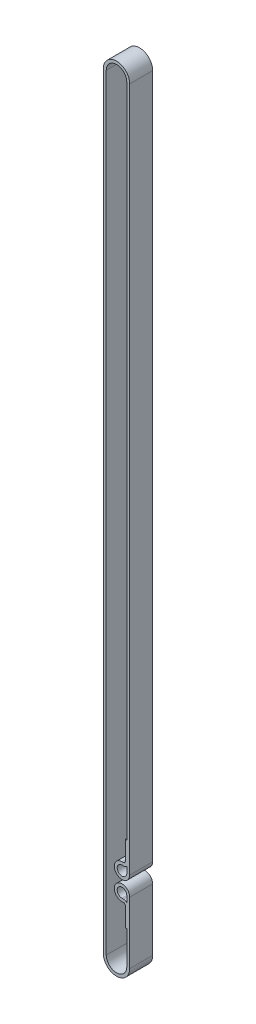
ISO-10303-21;
HEADER;
FILE_DESCRIPTION(('STEP AP214'),'2;1');
FILE_NAME('part.step','',(''),(''),'','','');
FILE_SCHEMA(('AUTOMOTIVE_DESIGN { 1 0 10303 214 1 1 1 1 }'));
ENDSEC;
DATA;
#1=APPLICATION_CONTEXT('core data for automotive mechanical design processes');
#2=APPLICATION_PROTOCOL_DEFINITION('international standard','automotive_design',2000,#1);
#3=PRODUCT_CONTEXT('',#1,'mechanical');
#4=PRODUCT('Part','Part','',(#3));
#5=PRODUCT_RELATED_PRODUCT_CATEGORY('part','',(#4));
#6=PRODUCT_DEFINITION_FORMATION('','',#4);
#7=PRODUCT_DEFINITION_CONTEXT('part definition',#1,'design');
#8=PRODUCT_DEFINITION('design','',#6,#7);
#9=PRODUCT_DEFINITION_SHAPE('','',#8);
#10=(LENGTH_UNIT() NAMED_UNIT(*) SI_UNIT(.MILLI.,.METRE.));
#11=(NAMED_UNIT(*) PLANE_ANGLE_UNIT() SI_UNIT($,.RADIAN.));
#12=(NAMED_UNIT(*) SI_UNIT($,.STERADIAN.) SOLID_ANGLE_UNIT());
#13=UNCERTAINTY_MEASURE_WITH_UNIT(LENGTH_MEASURE(1.E-05),#10,'distance_accuracy_value','');
#14=(GEOMETRIC_REPRESENTATION_CONTEXT(3) GLOBAL_UNCERTAINTY_ASSIGNED_CONTEXT((#13)) GLOBAL_UNIT_ASSIGNED_CONTEXT((#10,
#11,#12)) REPRESENTATION_CONTEXT('',''));
#15=CARTESIAN_POINT('',(0.,0.,0.));
#16=DIRECTION('',(0.,0.,1.));
#17=DIRECTION('',(1.,0.,0.));
#18=AXIS2_PLACEMENT_3D('',#15,#16,#17);
#19=CARTESIAN_POINT('',(4.591,-342.696,12.));
#20=DIRECTION('',(0.,1.,0.));
#21=DIRECTION('',(0.,0.,1.));
#22=AXIS2_PLACEMENT_3D('',#19,#20,#21);
#23=PLANE('',#22);
#24=DIRECTION('',(1.,0.,0.));
#25=VECTOR('',#24,1.);
#26=CARTESIAN_POINT('',(4.591,-342.696,0.));
#27=LINE('',#26,#25);
#28=CARTESIAN_POINT('',(4.591,-342.696,0.));
#29=VERTEX_POINT('',#28);
#30=CARTESIAN_POINT('',(5.36099999999995,-342.696,0.));
#31=VERTEX_POINT('',#30);
#32=EDGE_CURVE('E180',#29,#31,#27,.T.);
#33=ORIENTED_EDGE('',*,*,#32,.F.);
#34=DIRECTION('',(0.,0.,-1.));
#35=VECTOR('',#34,1.);
#36=CARTESIAN_POINT('',(4.591,-342.696,12.));
#37=LINE('',#36,#35);
#38=CARTESIAN_POINT('',(4.591,-342.696,12.));
#39=VERTEX_POINT('',#38);
#40=EDGE_CURVE('E11',#39,#29,#37,.T.);
#41=ORIENTED_EDGE('',*,*,#40,.F.);
#42=DIRECTION('',(1.,0.,0.));
#43=VECTOR('',#42,1.);
#44=CARTESIAN_POINT('',(4.591,-342.696,12.));
#45=LINE('',#44,#43);
#46=CARTESIAN_POINT('',(5.36099999999995,-342.696,12.));
#47=VERTEX_POINT('',#46);
#48=EDGE_CURVE('E223',#39,#47,#45,.T.);
#49=ORIENTED_EDGE('',*,*,#48,.T.);
#50=DIRECTION('',(0.,0.,1.));
#51=VECTOR('',#50,1.);
#52=CARTESIAN_POINT('',(5.36099999999995,-342.696,-412.926271627272));
#53=LINE('',#52,#51);
#54=EDGE_CURVE('E309',#31,#47,#53,.T.);
#55=ORIENTED_EDGE('',*,*,#54,.F.);
#56=EDGE_LOOP('',(#33,#41,#49,#55));
#57=FACE_BOUND('',#56,.T.);
#58=ADVANCED_FACE('F41',(#57),#23,.T.);
#59=CARTESIAN_POINT('',(4.591,-342.696,12.));
#60=DIRECTION('',(-1.,0.,0.));
#61=DIRECTION('',(0.,0.,1.));
#62=AXIS2_PLACEMENT_3D('',#59,#60,#61);
#63=PLANE('',#62);
#64=DIRECTION('',(0.,1.,0.));
#65=VECTOR('',#64,1.);
#66=CARTESIAN_POINT('',(4.591,-342.696,0.));
#67=LINE('',#66,#65);
#68=CARTESIAN_POINT('',(4.591,-352.696,0.));
#69=VERTEX_POINT('',#68);
#70=EDGE_CURVE('E183',#69,#29,#67,.T.);
#71=ORIENTED_EDGE('',*,*,#70,.F.);
#72=DIRECTION('',(0.,0.,-1.));
#73=VECTOR('',#72,1.);
#74=CARTESIAN_POINT('',(4.591,-352.696,12.));
#75=LINE('',#74,#73);
#76=CARTESIAN_POINT('',(4.591,-352.696,12.));
#77=VERTEX_POINT('',#76);
#78=EDGE_CURVE('E49',#77,#69,#75,.T.);
#79=ORIENTED_EDGE('',*,*,#78,.F.);
#80=DIRECTION('',(0.,1.,0.));
#81=VECTOR('',#80,1.);
#82=CARTESIAN_POINT('',(4.591,-342.696,12.));
#83=LINE('',#82,#81);
#84=EDGE_CURVE('E265',#77,#39,#83,.T.);
#85=ORIENTED_EDGE('',*,*,#84,.T.);
#86=ORIENTED_EDGE('',*,*,#40,.T.);
#87=EDGE_LOOP('',(#71,#79,#85,#86));
#88=FACE_BOUND('',#87,.T.);
#89=ADVANCED_FACE('F252',(#88),#63,.T.);
#90=CARTESIAN_POINT('',(3.607,-352.696,12.));
#91=DIRECTION('',(0.,0.,-1.));
#92=DIRECTION('',(-1.,0.,0.));
#93=AXIS2_PLACEMENT_3D('',#90,#91,#92);
#94=CYLINDRICAL_SURFACE('',#93,0.984000000000029);
#95=CARTESIAN_POINT('',(3.607,-352.696,0.));
#96=DIRECTION('',(0.,0.,1.));
#97=DIRECTION('',(1.,0.,0.));
#98=AXIS2_PLACEMENT_3D('',#95,#96,#97);
#99=CIRCLE('',#98,0.984000000000029);
#100=CARTESIAN_POINT('',(3.607,-353.68,0.));
#101=VERTEX_POINT('',#100);
#102=EDGE_CURVE('E187',#101,#69,#99,.T.);
#103=ORIENTED_EDGE('',*,*,#102,.F.);
#104=DIRECTION('',(0.,0.,-1.));
#105=VECTOR('',#104,1.);
#106=CARTESIAN_POINT('',(3.607,-353.68,12.));
#107=LINE('',#106,#105);
#108=CARTESIAN_POINT('',(3.607,-353.68,12.));
#109=VERTEX_POINT('',#108);
#110=EDGE_CURVE('E241',#109,#101,#107,.T.);
#111=ORIENTED_EDGE('',*,*,#110,.F.);
#112=CARTESIAN_POINT('',(3.607,-352.696,12.));
#113=DIRECTION('',(0.,0.,1.));
#114=DIRECTION('',(1.,0.,0.));
#115=AXIS2_PLACEMENT_3D('',#112,#113,#114);
#116=CIRCLE('',#115,0.984000000000029);
#117=EDGE_CURVE('E248',#109,#77,#116,.T.);
#118=ORIENTED_EDGE('',*,*,#117,.T.);
#119=ORIENTED_EDGE('',*,*,#78,.T.);
#120=EDGE_LOOP('',(#103,#111,#118,#119));
#121=FACE_BOUND('',#120,.T.);
#122=ADVANCED_FACE('F246',(#121),#94,.F.);
#123=CARTESIAN_POINT('',(2.861,-353.68,12.));
#124=DIRECTION('',(0.,1.,0.));
#125=DIRECTION('',(0.,0.,1.));
#126=AXIS2_PLACEMENT_3D('',#123,#124,#125);
#127=PLANE('',#126);
#128=DIRECTION('',(1.,0.,0.));
#129=VECTOR('',#128,1.);
#130=CARTESIAN_POINT('',(2.861,-353.68,0.));
#131=LINE('',#130,#129);
#132=CARTESIAN_POINT('',(2.861,-353.68,0.));
#133=VERTEX_POINT('',#132);
#134=EDGE_CURVE('E190',#133,#101,#131,.T.);
#135=ORIENTED_EDGE('',*,*,#134,.F.);
#136=DIRECTION('',(0.,0.,-1.));
#137=VECTOR('',#136,1.);
#138=CARTESIAN_POINT('',(2.861,-353.68,12.));
#139=LINE('',#138,#137);
#140=CARTESIAN_POINT('',(2.861,-353.68,12.));
#141=VERTEX_POINT('',#140);
#142=EDGE_CURVE('E239',#141,#133,#139,.T.);
#143=ORIENTED_EDGE('',*,*,#142,.F.);
#144=DIRECTION('',(1.,0.,0.));
#145=VECTOR('',#144,1.);
#146=CARTESIAN_POINT('',(2.861,-353.68,12.));
#147=LINE('',#146,#145);
#148=EDGE_CURVE('E262',#141,#109,#147,.T.);
#149=ORIENTED_EDGE('',*,*,#148,.T.);
#150=ORIENTED_EDGE('',*,*,#110,.T.);
#151=EDGE_LOOP('',(#135,#143,#149,#150));
#152=FACE_BOUND('',#151,.T.);
#153=ADVANCED_FACE('F259',(#152),#127,.T.);
#154=CARTESIAN_POINT('',(2.861,-357.7,12.));
#155=DIRECTION('',(0.,0.,-1.));
#156=DIRECTION('',(-1.,0.,0.));
#157=AXIS2_PLACEMENT_3D('',#154,#155,#156);
#158=CYLINDRICAL_SURFACE('',#157,4.01999999999995);
#159=CARTESIAN_POINT('',(2.861,-357.7,0.));
#160=DIRECTION('',(0.,0.,1.));
#161=DIRECTION('',(1.,0.,0.));
#162=AXIS2_PLACEMENT_3D('',#159,#160,#161);
#163=CIRCLE('',#162,4.01999999999995);
#164=CARTESIAN_POINT('',(6.88099999999995,-357.7,0.));
#165=VERTEX_POINT('',#164);
#166=EDGE_CURVE('E193',#165,#133,#163,.F.);
#167=ORIENTED_EDGE('',*,*,#166,.F.);
#168=DIRECTION('',(0.,0.,-1.));
#169=VECTOR('',#168,1.);
#170=CARTESIAN_POINT('',(6.88099999999995,-357.7,12.));
#171=LINE('',#170,#169);
#172=CARTESIAN_POINT('',(6.88099999999995,-357.7,12.));
#173=VERTEX_POINT('',#172);
#174=EDGE_CURVE('E237',#173,#165,#171,.T.);
#175=ORIENTED_EDGE('',*,*,#174,.F.);
#176=CARTESIAN_POINT('',(2.861,-357.7,12.));
#177=DIRECTION('',(0.,0.,1.));
#178=DIRECTION('',(1.,0.,0.));
#179=AXIS2_PLACEMENT_3D('',#176,#177,#178);
#180=CIRCLE('',#179,4.01999999999995);
#181=EDGE_CURVE('E267',#173,#141,#180,.F.);
#182=ORIENTED_EDGE('',*,*,#181,.T.);
#183=ORIENTED_EDGE('',*,*,#142,.T.);
#184=EDGE_LOOP('',(#167,#175,#182,#183));
#185=FACE_BOUND('',#184,.T.);
#186=ADVANCED_FACE('F755',(#185),#158,.T.);
#187=CARTESIAN_POINT('',(6.88099999999995,-357.7,12.));
#188=DIRECTION('',(1.,0.,0.));
#189=DIRECTION('',(0.,1.,0.));
#190=AXIS2_PLACEMENT_3D('',#187,#188,#189);
#191=PLANE('',#190);
#192=DIRECTION('',(0.,-1.,0.));
#193=VECTOR('',#192,1.);
#194=CARTESIAN_POINT('',(6.88099999999995,-357.7,0.));
#195=LINE('',#194,#193);
#196=CARTESIAN_POINT('',(6.881,0.,0.));
#197=VERTEX_POINT('',#196);
#198=EDGE_CURVE('E196',#197,#165,#195,.T.);
#199=ORIENTED_EDGE('',*,*,#198,.F.);
#200=DIRECTION('',(0.,0.,-1.));
#201=VECTOR('',#200,1.);
#202=CARTESIAN_POINT('',(6.881,0.,12.));
#203=LINE('',#202,#201);
#204=CARTESIAN_POINT('',(6.881,0.,12.));
#205=VERTEX_POINT('',#204);
#206=EDGE_CURVE('E235',#205,#197,#203,.T.);
#207=ORIENTED_EDGE('',*,*,#206,.F.);
#208=DIRECTION('',(0.,-1.,0.));
#209=VECTOR('',#208,1.);
#210=CARTESIAN_POINT('',(6.88099999999995,-357.7,12.));
#211=LINE('',#210,#209);
#212=EDGE_CURVE('E273',#205,#173,#211,.T.);
#213=ORIENTED_EDGE('',*,*,#212,.T.);
#214=ORIENTED_EDGE('',*,*,#174,.T.);
#215=EDGE_LOOP('',(#199,#207,#213,#214));
#216=FACE_BOUND('',#215,.T.);
#217=ADVANCED_FACE('F631',(#216),#191,.T.);
#218=CARTESIAN_POINT('',(0.,0.,12.));
#219=DIRECTION('',(0.,0.,-1.));
#220=DIRECTION('',(-1.,0.,0.));
#221=AXIS2_PLACEMENT_3D('',#218,#219,#220);
#222=CYLINDRICAL_SURFACE('',#221,6.881);
#223=CARTESIAN_POINT('',(0.,0.,0.));
#224=DIRECTION('',(0.,0.,1.));
#225=DIRECTION('',(1.,0.,0.));
#226=AXIS2_PLACEMENT_3D('',#223,#224,#225);
#227=CIRCLE('',#226,6.881);
#228=CARTESIAN_POINT('',(-6.881,0.,0.));
#229=VERTEX_POINT('',#228);
#230=EDGE_CURVE('E199',#229,#197,#227,.F.);
#231=ORIENTED_EDGE('',*,*,#230,.F.);
#232=DIRECTION('',(0.,0.,-1.));
#233=VECTOR('',#232,1.);
#234=CARTESIAN_POINT('',(-6.881,0.,12.));
#235=LINE('',#234,#233);
#236=CARTESIAN_POINT('',(-6.881,0.,12.));
#237=VERTEX_POINT('',#236);
#238=EDGE_CURVE('E233',#237,#229,#235,.T.);
#239=ORIENTED_EDGE('',*,*,#238,.F.);
#240=CARTESIAN_POINT('',(0.,0.,12.));
#241=DIRECTION('',(0.,0.,1.));
#242=DIRECTION('',(1.,0.,0.));
#243=AXIS2_PLACEMENT_3D('',#240,#241,#242);
#244=CIRCLE('',#243,6.881);
#245=EDGE_CURVE('E276',#237,#205,#244,.F.);
#246=ORIENTED_EDGE('',*,*,#245,.T.);
#247=ORIENTED_EDGE('',*,*,#206,.T.);
#248=EDGE_LOOP('',(#231,#239,#246,#247));
#249=FACE_BOUND('',#248,.T.);
#250=ADVANCED_FACE('F625',(#249),#222,.T.);
#251=CARTESIAN_POINT('',(-6.881,0.,12.));
#252=DIRECTION('',(-1.,0.,0.));
#253=DIRECTION('',(0.,-1.,0.));
#254=AXIS2_PLACEMENT_3D('',#251,#252,#253);
#255=PLANE('',#254);
#256=DIRECTION('',(0.,1.,0.));
#257=VECTOR('',#256,1.);
#258=CARTESIAN_POINT('',(-6.881,0.,0.));
#259=LINE('',#258,#257);
#260=CARTESIAN_POINT('',(-6.88099999999995,-400.,0.));
#261=VERTEX_POINT('',#260);
#262=EDGE_CURVE('E202',#261,#229,#259,.T.);
#263=ORIENTED_EDGE('',*,*,#262,.F.);
#264=DIRECTION('',(0.,0.,-1.));
#265=VECTOR('',#264,1.);
#266=CARTESIAN_POINT('',(-6.88099999999995,-400.,12.));
#267=LINE('',#266,#265);
#268=CARTESIAN_POINT('',(-6.88099999999995,-400.,12.));
#269=VERTEX_POINT('',#268);
#270=EDGE_CURVE('E231',#269,#261,#267,.T.);
#271=ORIENTED_EDGE('',*,*,#270,.F.);
#272=DIRECTION('',(0.,1.,0.));
#273=VECTOR('',#272,1.);
#274=CARTESIAN_POINT('',(-6.881,0.,12.));
#275=LINE('',#274,#273);
#276=EDGE_CURVE('E279',#269,#237,#275,.T.);
#277=ORIENTED_EDGE('',*,*,#276,.T.);
#278=ORIENTED_EDGE('',*,*,#238,.T.);
#279=EDGE_LOOP('',(#263,#271,#277,#278));
#280=FACE_BOUND('',#279,.T.);
#281=ADVANCED_FACE('F630',(#280),#255,.T.);
#282=CARTESIAN_POINT('',(0.,-400.,12.));
#283=DIRECTION('',(0.,0.,-1.));
#284=DIRECTION('',(-1.,0.,0.));
#285=AXIS2_PLACEMENT_3D('',#282,#283,#284);
#286=CYLINDRICAL_SURFACE('',#285,6.88099999999995);
#287=CARTESIAN_POINT('',(0.,-400.,0.));
#288=DIRECTION('',(0.,0.,1.));
#289=DIRECTION('',(1.,0.,0.));
#290=AXIS2_PLACEMENT_3D('',#287,#288,#289);
#291=CIRCLE('',#290,6.88099999999995);
#292=CARTESIAN_POINT('',(6.88099999999995,-400.,0.));
#293=VERTEX_POINT('',#292);
#294=EDGE_CURVE('E205',#293,#261,#291,.F.);
#295=ORIENTED_EDGE('',*,*,#294,.F.);
#296=DIRECTION('',(0.,0.,-1.));
#297=VECTOR('',#296,1.);
#298=CARTESIAN_POINT('',(6.88099999999995,-400.,12.));
#299=LINE('',#298,#297);
#300=CARTESIAN_POINT('',(6.88099999999995,-400.,12.));
#301=VERTEX_POINT('',#300);
#302=EDGE_CURVE('E229',#301,#293,#299,.T.);
#303=ORIENTED_EDGE('',*,*,#302,.F.);
#304=CARTESIAN_POINT('',(0.,-400.,12.));
#305=DIRECTION('',(0.,0.,1.));
#306=DIRECTION('',(1.,0.,0.));
#307=AXIS2_PLACEMENT_3D('',#304,#305,#306);
#308=CIRCLE('',#307,6.88099999999995);
#309=EDGE_CURVE('E282',#301,#269,#308,.F.);
#310=ORIENTED_EDGE('',*,*,#309,.T.);
#311=ORIENTED_EDGE('',*,*,#270,.T.);
#312=EDGE_LOOP('',(#295,#303,#310,#311));
#313=FACE_BOUND('',#312,.T.);
#314=ADVANCED_FACE('F615',(#313),#286,.T.);
#315=CARTESIAN_POINT('',(6.88099999999995,-400.,12.));
#316=DIRECTION('',(1.,0.,0.));
#317=DIRECTION('',(0.,0.,-1.));
#318=AXIS2_PLACEMENT_3D('',#315,#316,#317);
#319=PLANE('',#318);
#320=DIRECTION('',(0.,1.,0.));
#321=VECTOR('',#320,1.);
#322=CARTESIAN_POINT('',(6.88099999999995,-400.,0.));
#323=LINE('',#322,#321);
#324=CARTESIAN_POINT('',(6.88099999999995,-367.7,0.));
#325=VERTEX_POINT('',#324);
#326=EDGE_CURVE('E208',#325,#293,#323,.F.);
#327=ORIENTED_EDGE('',*,*,#326,.F.);
#328=DIRECTION('',(0.,0.,-1.));
#329=VECTOR('',#328,1.);
#330=CARTESIAN_POINT('',(6.88099999999995,-367.7,12.));
#331=LINE('',#330,#329);
#332=CARTESIAN_POINT('',(6.88099999999995,-367.7,12.));
#333=VERTEX_POINT('',#332);
#334=EDGE_CURVE('E227',#333,#325,#331,.T.);
#335=ORIENTED_EDGE('',*,*,#334,.F.);
#336=DIRECTION('',(0.,1.,0.));
#337=VECTOR('',#336,1.);
#338=CARTESIAN_POINT('',(6.88099999999995,-400.,12.));
#339=LINE('',#338,#337);
#340=EDGE_CURVE('E285',#333,#301,#339,.F.);
#341=ORIENTED_EDGE('',*,*,#340,.T.);
#342=ORIENTED_EDGE('',*,*,#302,.T.);
#343=EDGE_LOOP('',(#327,#335,#341,#342));
#344=FACE_BOUND('',#343,.T.);
#345=ADVANCED_FACE('F610',(#344),#319,.T.);
#346=CARTESIAN_POINT('',(2.861,-367.7,12.));
#347=DIRECTION('',(0.,0.,-1.));
#348=DIRECTION('',(-1.,0.,0.));
#349=AXIS2_PLACEMENT_3D('',#346,#347,#348);
#350=CYLINDRICAL_SURFACE('',#349,4.01999999999995);
#351=CARTESIAN_POINT('',(2.861,-367.7,0.));
#352=DIRECTION('',(0.,0.,1.));
#353=DIRECTION('',(1.,0.,0.));
#354=AXIS2_PLACEMENT_3D('',#351,#352,#353);
#355=CIRCLE('',#354,4.01999999999995);
#356=CARTESIAN_POINT('',(2.861,-371.72,0.));
#357=VERTEX_POINT('',#356);
#358=EDGE_CURVE('E211',#357,#325,#355,.F.);
#359=ORIENTED_EDGE('',*,*,#358,.F.);
#360=DIRECTION('',(0.,0.,-1.));
#361=VECTOR('',#360,1.);
#362=CARTESIAN_POINT('',(2.861,-371.72,12.));
#363=LINE('',#362,#361);
#364=CARTESIAN_POINT('',(2.861,-371.72,12.));
#365=VERTEX_POINT('',#364);
#366=EDGE_CURVE('E159',#365,#357,#363,.T.);
#367=ORIENTED_EDGE('',*,*,#366,.F.);
#368=CARTESIAN_POINT('',(2.861,-367.7,12.));
#369=DIRECTION('',(0.,0.,1.));
#370=DIRECTION('',(1.,0.,0.));
#371=AXIS2_PLACEMENT_3D('',#368,#369,#370);
#372=CIRCLE('',#371,4.01999999999995);
#373=EDGE_CURVE('E170',#365,#333,#372,.F.);
#374=ORIENTED_EDGE('',*,*,#373,.T.);
#375=ORIENTED_EDGE('',*,*,#334,.T.);
#376=EDGE_LOOP('',(#359,#367,#374,#375));
#377=FACE_BOUND('',#376,.T.);
#378=ADVANCED_FACE('F289',(#377),#350,.T.);
#379=CARTESIAN_POINT('',(2.861,-371.72,12.));
#380=DIRECTION('',(0.,-1.,0.));
#381=DIRECTION('',(0.,0.,-1.));
#382=AXIS2_PLACEMENT_3D('',#379,#380,#381);
#383=PLANE('',#382);
#384=DIRECTION('',(1.,0.,0.));
#385=VECTOR('',#384,1.);
#386=CARTESIAN_POINT('',(2.861,-371.72,0.));
#387=LINE('',#386,#385);
#388=CARTESIAN_POINT('',(3.607,-371.72,0.));
#389=VERTEX_POINT('',#388);
#390=EDGE_CURVE('E155',#389,#357,#387,.F.);
#391=ORIENTED_EDGE('',*,*,#390,.F.);
#392=DIRECTION('',(0.,0.,-1.));
#393=VECTOR('',#392,1.);
#394=CARTESIAN_POINT('',(3.607,-371.72,12.));
#395=LINE('',#394,#393);
#396=CARTESIAN_POINT('',(3.607,-371.72,12.));
#397=VERTEX_POINT('',#396);
#398=EDGE_CURVE('E150',#397,#389,#395,.T.);
#399=ORIENTED_EDGE('',*,*,#398,.F.);
#400=DIRECTION('',(1.,0.,0.));
#401=VECTOR('',#400,1.);
#402=CARTESIAN_POINT('',(2.861,-371.72,12.));
#403=LINE('',#402,#401);
#404=EDGE_CURVE('E153',#397,#365,#403,.F.);
#405=ORIENTED_EDGE('',*,*,#404,.T.);
#406=ORIENTED_EDGE('',*,*,#366,.T.);
#407=EDGE_LOOP('',(#391,#399,#405,#406));
#408=FACE_BOUND('',#407,.T.);
#409=ADVANCED_FACE('F152',(#408),#383,.T.);
#410=CARTESIAN_POINT('',(3.607,-372.704,12.));
#411=DIRECTION('',(0.,0.,-1.));
#412=DIRECTION('',(-1.,0.,0.));
#413=AXIS2_PLACEMENT_3D('',#410,#411,#412);
#414=CYLINDRICAL_SURFACE('',#413,0.984000000000029);
#415=CARTESIAN_POINT('',(3.607,-372.704,0.));
#416=DIRECTION('',(0.,0.,1.));
#417=DIRECTION('',(1.,0.,0.));
#418=AXIS2_PLACEMENT_3D('',#415,#416,#417);
#419=CIRCLE('',#418,0.984000000000029);
#420=CARTESIAN_POINT('',(4.59100000000003,-372.704,0.));
#421=VERTEX_POINT('',#420);
#422=EDGE_CURVE('E215',#421,#389,#419,.T.);
#423=ORIENTED_EDGE('',*,*,#422,.F.);
#424=DIRECTION('',(0.,0.,-1.));
#425=VECTOR('',#424,1.);
#426=CARTESIAN_POINT('',(4.59100000000003,-372.704,12.));
#427=LINE('',#426,#425);
#428=CARTESIAN_POINT('',(4.59100000000003,-372.704,12.));
#429=VERTEX_POINT('',#428);
#430=EDGE_CURVE('E101',#429,#421,#427,.T.);
#431=ORIENTED_EDGE('',*,*,#430,.F.);
#432=CARTESIAN_POINT('',(3.607,-372.704,12.));
#433=DIRECTION('',(0.,0.,1.));
#434=DIRECTION('',(1.,0.,0.));
#435=AXIS2_PLACEMENT_3D('',#432,#433,#434);
#436=CIRCLE('',#435,0.984000000000029);
#437=EDGE_CURVE('E167',#429,#397,#436,.T.);
#438=ORIENTED_EDGE('',*,*,#437,.T.);
#439=ORIENTED_EDGE('',*,*,#398,.T.);
#440=EDGE_LOOP('',(#423,#431,#438,#439));
#441=FACE_BOUND('',#440,.T.);
#442=ADVANCED_FACE('F172',(#441),#414,.F.);
#443=CARTESIAN_POINT('',(4.591,-382.704,12.));
#444=DIRECTION('',(-1.,0.,0.));
#445=DIRECTION('',(0.,0.,1.));
#446=AXIS2_PLACEMENT_3D('',#443,#444,#445);
#447=PLANE('',#446);
#448=DIRECTION('',(0.,1.,0.));
#449=VECTOR('',#448,1.);
#450=CARTESIAN_POINT('',(4.591,-382.704,0.));
#451=LINE('',#450,#449);
#452=CARTESIAN_POINT('',(4.591,-382.704,0.));
#453=VERTEX_POINT('',#452);
#454=EDGE_CURVE('E217',#453,#421,#451,.T.);
#455=ORIENTED_EDGE('',*,*,#454,.F.);
#456=DIRECTION('',(0.,0.,-1.));
#457=VECTOR('',#456,1.);
#458=CARTESIAN_POINT('',(4.591,-382.704,12.));
#459=LINE('',#458,#457);
#460=CARTESIAN_POINT('',(4.591,-382.704,12.));
#461=VERTEX_POINT('',#460);
#462=EDGE_CURVE('E57',#461,#453,#459,.T.);
#463=ORIENTED_EDGE('',*,*,#462,.F.);
#464=DIRECTION('',(0.,1.,0.));
#465=VECTOR('',#464,1.);
#466=CARTESIAN_POINT('',(4.591,-382.704,12.));
#467=LINE('',#466,#465);
#468=EDGE_CURVE('E173',#461,#429,#467,.T.);
#469=ORIENTED_EDGE('',*,*,#468,.T.);
#470=ORIENTED_EDGE('',*,*,#430,.T.);
#471=EDGE_LOOP('',(#455,#463,#469,#470));
#472=FACE_BOUND('',#471,.T.);
#473=ADVANCED_FACE('F292',(#472),#447,.T.);
#474=CARTESIAN_POINT('',(5.107,-382.704,12.));
#475=DIRECTION('',(0.,-1.,0.));
#476=DIRECTION('',(0.,0.,-1.));
#477=AXIS2_PLACEMENT_3D('',#474,#475,#476);
#478=PLANE('',#477);
#479=DIRECTION('',(-1.,0.,0.));
#480=VECTOR('',#479,1.);
#481=CARTESIAN_POINT('',(5.107,-382.704,0.));
#482=LINE('',#481,#480);
#483=CARTESIAN_POINT('',(5.36099999999995,-382.704,0.));
#484=VERTEX_POINT('',#483);
#485=EDGE_CURVE('E220',#484,#453,#482,.T.);
#486=ORIENTED_EDGE('',*,*,#485,.F.);
#487=DIRECTION('',(0.,0.,1.));
#488=VECTOR('',#487,1.);
#489=CARTESIAN_POINT('',(5.36099999999995,-382.704,-412.926271627272));
#490=LINE('',#489,#488);
#491=CARTESIAN_POINT('',(5.36099999999995,-382.704,12.));
#492=VERTEX_POINT('',#491);
#493=EDGE_CURVE('E403',#484,#492,#490,.T.);
#494=ORIENTED_EDGE('',*,*,#493,.T.);
#495=DIRECTION('',(-1.,0.,0.));
#496=VECTOR('',#495,1.);
#497=CARTESIAN_POINT('',(5.107,-382.704,12.));
#498=LINE('',#497,#496);
#499=EDGE_CURVE('E175',#492,#461,#498,.T.);
#500=ORIENTED_EDGE('',*,*,#499,.T.);
#501=ORIENTED_EDGE('',*,*,#462,.T.);
#502=EDGE_LOOP('',(#486,#494,#500,#501));
#503=FACE_BOUND('',#502,.T.);
#504=ADVANCED_FACE('F294',(#503),#478,.T.);
#505=CARTESIAN_POINT('',(3.607,-352.696,12.));
#506=DIRECTION('',(0.,0.,1.));
#507=DIRECTION('',(1.,0.,0.));
#508=AXIS2_PLACEMENT_3D('',#505,#506,#507);
#509=PLANE('',#508);
#510=ORIENTED_EDGE('',*,*,#499,.F.);
#511=DIRECTION('',(0.,-1.,0.));
#512=VECTOR('',#511,1.);
#513=CARTESIAN_POINT('',(5.36099999999993,0.,12.));
#514=LINE('',#513,#512);
#515=CARTESIAN_POINT('',(5.36099999999995,-400.,12.));
#516=VERTEX_POINT('',#515);
#517=EDGE_CURVE('E356',#492,#516,#514,.T.);
#518=ORIENTED_EDGE('',*,*,#517,.T.);
#519=CARTESIAN_POINT('',(0.,-400.,12.));
#520=DIRECTION('',(0.,0.,1.));
#521=DIRECTION('',(1.,0.,0.));
#522=AXIS2_PLACEMENT_3D('',#519,#520,#521);
#523=CIRCLE('',#522,5.36099999999995);
#524=CARTESIAN_POINT('',(-5.36099999999995,-400.,12.));
#525=VERTEX_POINT('',#524);
#526=EDGE_CURVE('E368',#525,#516,#523,.T.);
#527=ORIENTED_EDGE('',*,*,#526,.F.);
#528=DIRECTION('',(0.,1.,0.));
#529=VECTOR('',#528,1.);
#530=CARTESIAN_POINT('',(-5.361,0.,12.));
#531=LINE('',#530,#529);
#532=CARTESIAN_POINT('',(-5.361,0.,12.));
#533=VERTEX_POINT('',#532);
#534=EDGE_CURVE('E357',#525,#533,#531,.T.);
#535=ORIENTED_EDGE('',*,*,#534,.T.);
#536=CARTESIAN_POINT('',(0.,0.,12.));
#537=DIRECTION('',(0.,0.,1.));
#538=DIRECTION('',(1.,0.,0.));
#539=AXIS2_PLACEMENT_3D('',#536,#537,#538);
#540=CIRCLE('',#539,5.361);
#541=CARTESIAN_POINT('',(5.361,0.,12.));
#542=VERTEX_POINT('',#541);
#543=EDGE_CURVE('E355',#542,#533,#540,.T.);
#544=ORIENTED_EDGE('',*,*,#543,.F.);
#545=DIRECTION('',(0.,-1.,0.));
#546=VECTOR('',#545,1.);
#547=CARTESIAN_POINT('',(5.361,0.,12.));
#548=LINE('',#547,#546);
#549=EDGE_CURVE('E352',#542,#47,#548,.T.);
#550=ORIENTED_EDGE('',*,*,#549,.T.);
#551=ORIENTED_EDGE('',*,*,#48,.F.);
#552=ORIENTED_EDGE('',*,*,#84,.F.);
#553=ORIENTED_EDGE('',*,*,#117,.F.);
#554=ORIENTED_EDGE('',*,*,#148,.F.);
#555=ORIENTED_EDGE('',*,*,#181,.F.);
#556=ORIENTED_EDGE('',*,*,#212,.F.);
#557=ORIENTED_EDGE('',*,*,#245,.F.);
#558=ORIENTED_EDGE('',*,*,#276,.F.);
#559=ORIENTED_EDGE('',*,*,#309,.F.);
#560=ORIENTED_EDGE('',*,*,#340,.F.);
#561=ORIENTED_EDGE('',*,*,#373,.F.);
#562=ORIENTED_EDGE('',*,*,#404,.F.);
#563=ORIENTED_EDGE('',*,*,#437,.F.);
#564=ORIENTED_EDGE('',*,*,#468,.F.);
#565=EDGE_LOOP('',(#510,#518,#527,#535,#544,#550,#551,#552,#553,#554,#555,#556,#557,#558,#559,
#560,#561,#562,#563,#564));
#566=FACE_BOUND('',#565,.T.);
#567=CARTESIAN_POINT('',(2.861,-367.7,12.));
#568=DIRECTION('',(0.,0.,1.));
#569=DIRECTION('',(1.,0.,0.));
#570=AXIS2_PLACEMENT_3D('',#567,#568,#569);
#571=CIRCLE('',#570,2.49999999999995);
#572=CARTESIAN_POINT('',(5.36099999999995,-367.7,12.));
#573=VERTEX_POINT('',#572);
#574=CARTESIAN_POINT('',(2.861,-370.2,12.));
#575=VERTEX_POINT('',#574);
#576=EDGE_CURVE('E392',#573,#575,#571,.T.);
#577=ORIENTED_EDGE('',*,*,#576,.F.);
#578=DIRECTION('',(0.,-1.,0.));
#579=VECTOR('',#578,1.);
#580=CARTESIAN_POINT('',(5.36099999999995,0.,12.));
#581=LINE('',#580,#579);
#582=CARTESIAN_POINT('',(5.36099999999995,-370.916963346766,12.));
#583=VERTEX_POINT('',#582);
#584=EDGE_CURVE('E360',#573,#583,#581,.T.);
#585=ORIENTED_EDGE('',*,*,#584,.T.);
#586=CARTESIAN_POINT('',(3.607,-372.704,12.));
#587=DIRECTION('',(0.,0.,1.));
#588=DIRECTION('',(1.,0.,0.));
#589=AXIS2_PLACEMENT_3D('',#586,#587,#588);
#590=CIRCLE('',#589,2.504);
#591=CARTESIAN_POINT('',(3.60700000000007,-370.2,12.));
#592=VERTEX_POINT('',#591);
#593=EDGE_CURVE('E498',#583,#592,#590,.T.);
#594=ORIENTED_EDGE('',*,*,#593,.T.);
#595=DIRECTION('',(-1.,0.,0.));
#596=VECTOR('',#595,1.);
#597=CARTESIAN_POINT('',(-2.75472227691817E-11,-370.2,12.));
#598=LINE('',#597,#596);
#599=EDGE_CURVE('E494',#592,#575,#598,.T.);
#600=ORIENTED_EDGE('',*,*,#599,.T.);
#601=EDGE_LOOP('',(#577,#585,#594,#600));
#602=FACE_BOUND('',#601,.T.);
#603=CARTESIAN_POINT('',(2.861,-357.7,12.));
#604=DIRECTION('',(0.,0.,1.));
#605=DIRECTION('',(1.,0.,0.));
#606=AXIS2_PLACEMENT_3D('',#603,#604,#605);
#607=CIRCLE('',#606,2.49999999999995);
#608=CARTESIAN_POINT('',(2.861,-355.2,12.));
#609=VERTEX_POINT('',#608);
#610=CARTESIAN_POINT('',(5.36099999999995,-357.7,12.));
#611=VERTEX_POINT('',#610);
#612=EDGE_CURVE('E379',#609,#611,#607,.T.);
#613=ORIENTED_EDGE('',*,*,#612,.F.);
#614=DIRECTION('',(1.,0.,0.));
#615=VECTOR('',#614,1.);
#616=CARTESIAN_POINT('',(0.,-355.2,12.));
#617=LINE('',#616,#615);
#618=CARTESIAN_POINT('',(3.607,-355.2,12.));
#619=VERTEX_POINT('',#618);
#620=EDGE_CURVE('E497',#609,#619,#617,.T.);
#621=ORIENTED_EDGE('',*,*,#620,.T.);
#622=CARTESIAN_POINT('',(3.607,-352.696,12.));
#623=DIRECTION('',(0.,0.,1.));
#624=DIRECTION('',(1.,0.,0.));
#625=AXIS2_PLACEMENT_3D('',#622,#623,#624);
#626=CIRCLE('',#625,2.50400000000005);
#627=CARTESIAN_POINT('',(5.36099999999995,-354.483036653234,12.));
#628=VERTEX_POINT('',#627);
#629=EDGE_CURVE('E501',#619,#628,#626,.T.);
#630=ORIENTED_EDGE('',*,*,#629,.T.);
#631=DIRECTION('',(0.,-1.,0.));
#632=VECTOR('',#631,1.);
#633=CARTESIAN_POINT('',(5.36100000000014,0.,12.));
#634=LINE('',#633,#632);
#635=EDGE_CURVE('E346',#628,#611,#634,.T.);
#636=ORIENTED_EDGE('',*,*,#635,.T.);
#637=EDGE_LOOP('',(#613,#621,#630,#636));
#638=FACE_BOUND('',#637,.T.);
#639=ADVANCED_FACE('F165',(#566,#602,#638),#509,.T.);
#640=CARTESIAN_POINT('',(3.607,-352.696,0.));
#641=DIRECTION('',(0.,0.,1.));
#642=DIRECTION('',(1.,0.,0.));
#643=AXIS2_PLACEMENT_3D('',#640,#641,#642);
#644=PLANE('',#643);
#645=ORIENTED_EDGE('',*,*,#32,.T.);
#646=DIRECTION('',(0.,1.,0.));
#647=VECTOR('',#646,1.);
#648=CARTESIAN_POINT('',(5.361,0.,0.));
#649=LINE('',#648,#647);
#650=CARTESIAN_POINT('',(5.361,0.,0.));
#651=VERTEX_POINT('',#650);
#652=EDGE_CURVE('E314',#31,#651,#649,.T.);
#653=ORIENTED_EDGE('',*,*,#652,.T.);
#654=CARTESIAN_POINT('',(0.,0.,0.));
#655=DIRECTION('',(0.,0.,1.));
#656=DIRECTION('',(1.,0.,0.));
#657=AXIS2_PLACEMENT_3D('',#654,#655,#656);
#658=CIRCLE('',#657,5.361);
#659=CARTESIAN_POINT('',(-5.361,0.,0.));
#660=VERTEX_POINT('',#659);
#661=EDGE_CURVE('E336',#660,#651,#658,.F.);
#662=ORIENTED_EDGE('',*,*,#661,.F.);
#663=DIRECTION('',(0.,-1.,0.));
#664=VECTOR('',#663,1.);
#665=CARTESIAN_POINT('',(-5.361,0.,0.));
#666=LINE('',#665,#664);
#667=CARTESIAN_POINT('',(-5.36099999999995,-400.,0.));
#668=VERTEX_POINT('',#667);
#669=EDGE_CURVE('E326',#660,#668,#666,.T.);
#670=ORIENTED_EDGE('',*,*,#669,.T.);
#671=CARTESIAN_POINT('',(0.,-400.,0.));
#672=DIRECTION('',(0.,0.,1.));
#673=DIRECTION('',(1.,0.,0.));
#674=AXIS2_PLACEMENT_3D('',#671,#672,#673);
#675=CIRCLE('',#674,5.36099999999995);
#676=CARTESIAN_POINT('',(5.36099999999995,-400.,0.));
#677=VERTEX_POINT('',#676);
#678=EDGE_CURVE('E395',#677,#668,#675,.F.);
#679=ORIENTED_EDGE('',*,*,#678,.F.);
#680=DIRECTION('',(0.,1.,0.));
#681=VECTOR('',#680,1.);
#682=CARTESIAN_POINT('',(5.36099999999993,0.,0.));
#683=LINE('',#682,#681);
#684=EDGE_CURVE('E327',#677,#484,#683,.T.);
#685=ORIENTED_EDGE('',*,*,#684,.T.);
#686=ORIENTED_EDGE('',*,*,#485,.T.);
#687=ORIENTED_EDGE('',*,*,#454,.T.);
#688=ORIENTED_EDGE('',*,*,#422,.T.);
#689=ORIENTED_EDGE('',*,*,#390,.T.);
#690=ORIENTED_EDGE('',*,*,#358,.T.);
#691=ORIENTED_EDGE('',*,*,#326,.T.);
#692=ORIENTED_EDGE('',*,*,#294,.T.);
#693=ORIENTED_EDGE('',*,*,#262,.T.);
#694=ORIENTED_EDGE('',*,*,#230,.T.);
#695=ORIENTED_EDGE('',*,*,#198,.T.);
#696=ORIENTED_EDGE('',*,*,#166,.T.);
#697=ORIENTED_EDGE('',*,*,#134,.T.);
#698=ORIENTED_EDGE('',*,*,#102,.T.);
#699=ORIENTED_EDGE('',*,*,#70,.T.);
#700=EDGE_LOOP('',(#645,#653,#662,#670,#679,#685,#686,#687,#688,#689,#690,#691,#692,#693,#694,
#695,#696,#697,#698,#699));
#701=FACE_BOUND('',#700,.T.);
#702=DIRECTION('',(0.,1.,0.));
#703=VECTOR('',#702,1.);
#704=CARTESIAN_POINT('',(5.36100000000014,0.,0.));
#705=LINE('',#704,#703);
#706=CARTESIAN_POINT('',(5.36099999999995,-357.7,0.));
#707=VERTEX_POINT('',#706);
#708=CARTESIAN_POINT('',(5.36099999999996,-354.483036653234,0.));
#709=VERTEX_POINT('',#708);
#710=EDGE_CURVE('E342',#707,#709,#705,.T.);
#711=ORIENTED_EDGE('',*,*,#710,.T.);
#712=CARTESIAN_POINT('',(3.607,-352.696,0.));
#713=DIRECTION('',(0.,0.,1.));
#714=DIRECTION('',(1.,0.,0.));
#715=AXIS2_PLACEMENT_3D('',#712,#713,#714);
#716=CIRCLE('',#715,2.50400000000005);
#717=CARTESIAN_POINT('',(3.607,-355.2,0.));
#718=VERTEX_POINT('',#717);
#719=EDGE_CURVE('E345',#709,#718,#716,.F.);
#720=ORIENTED_EDGE('',*,*,#719,.T.);
#721=DIRECTION('',(-1.,0.,0.));
#722=VECTOR('',#721,1.);
#723=CARTESIAN_POINT('',(0.,-355.2,0.));
#724=LINE('',#723,#722);
#725=CARTESIAN_POINT('',(2.861,-355.2,0.));
#726=VERTEX_POINT('',#725);
#727=EDGE_CURVE('E332',#718,#726,#724,.T.);
#728=ORIENTED_EDGE('',*,*,#727,.T.);
#729=CARTESIAN_POINT('',(2.861,-357.7,0.));
#730=DIRECTION('',(0.,0.,1.));
#731=DIRECTION('',(1.,0.,0.));
#732=AXIS2_PLACEMENT_3D('',#729,#730,#731);
#733=CIRCLE('',#732,2.49999999999995);
#734=EDGE_CURVE('E338',#707,#726,#733,.F.);
#735=ORIENTED_EDGE('',*,*,#734,.F.);
#736=EDGE_LOOP('',(#711,#720,#728,#735));
#737=FACE_BOUND('',#736,.T.);
#738=DIRECTION('',(1.,0.,0.));
#739=VECTOR('',#738,1.);
#740=CARTESIAN_POINT('',(-2.75472227691817E-11,-370.2,0.));
#741=LINE('',#740,#739);
#742=CARTESIAN_POINT('',(2.861,-370.2,0.));
#743=VERTEX_POINT('',#742);
#744=CARTESIAN_POINT('',(3.60700000000007,-370.2,0.));
#745=VERTEX_POINT('',#744);
#746=EDGE_CURVE('E330',#743,#745,#741,.T.);
#747=ORIENTED_EDGE('',*,*,#746,.T.);
#748=CARTESIAN_POINT('',(3.607,-372.704,0.));
#749=DIRECTION('',(0.,0.,1.));
#750=DIRECTION('',(1.,0.,0.));
#751=AXIS2_PLACEMENT_3D('',#748,#749,#750);
#752=CIRCLE('',#751,2.504);
#753=CARTESIAN_POINT('',(5.36099999999995,-370.916963346766,0.));
#754=VERTEX_POINT('',#753);
#755=EDGE_CURVE('E416',#745,#754,#752,.F.);
#756=ORIENTED_EDGE('',*,*,#755,.T.);
#757=DIRECTION('',(0.,1.,0.));
#758=VECTOR('',#757,1.);
#759=CARTESIAN_POINT('',(5.36099999999995,0.,0.));
#760=LINE('',#759,#758);
#761=CARTESIAN_POINT('',(5.36099999999995,-367.7,0.));
#762=VERTEX_POINT('',#761);
#763=EDGE_CURVE('E184',#754,#762,#760,.T.);
#764=ORIENTED_EDGE('',*,*,#763,.T.);
#765=CARTESIAN_POINT('',(2.861,-367.7,0.));
#766=DIRECTION('',(0.,0.,1.));
#767=DIRECTION('',(1.,0.,0.));
#768=AXIS2_PLACEMENT_3D('',#765,#766,#767);
#769=CIRCLE('',#768,2.49999999999995);
#770=EDGE_CURVE('E382',#743,#762,#769,.F.);
#771=ORIENTED_EDGE('',*,*,#770,.F.);
#772=EDGE_LOOP('',(#747,#756,#764,#771));
#773=FACE_BOUND('',#772,.T.);
#774=ADVANCED_FACE('F254',(#701,#737,#773),#644,.F.);
#775=CARTESIAN_POINT('',(2.861,-357.7,-412.926271627272));
#776=DIRECTION('',(0.,0.,1.));
#777=DIRECTION('',(1.,0.,0.));
#778=AXIS2_PLACEMENT_3D('',#775,#776,#777);
#779=CYLINDRICAL_SURFACE('',#778,2.49999999999995);
#780=DIRECTION('',(0.,0.,1.));
#781=VECTOR('',#780,1.);
#782=CARTESIAN_POINT('',(5.36099999999995,-357.7,-412.926271627272));
#783=LINE('',#782,#781);
#784=EDGE_CURVE('E375',#707,#611,#783,.T.);
#785=ORIENTED_EDGE('',*,*,#784,.F.);
#786=ORIENTED_EDGE('',*,*,#734,.T.);
#787=DIRECTION('',(0.,0.,1.));
#788=VECTOR('',#787,1.);
#789=CARTESIAN_POINT('',(2.861,-355.2,-412.926271627272));
#790=LINE('',#789,#788);
#791=EDGE_CURVE('E341',#726,#609,#790,.T.);
#792=ORIENTED_EDGE('',*,*,#791,.T.);
#793=ORIENTED_EDGE('',*,*,#612,.T.);
#794=EDGE_LOOP('',(#785,#786,#792,#793));
#795=FACE_BOUND('',#794,.T.);
#796=ADVANCED_FACE('F550',(#795),#779,.F.);
#797=CARTESIAN_POINT('',(5.36100000000014,0.,-412.926271627272));
#798=DIRECTION('',(-1.,0.,0.));
#799=DIRECTION('',(0.,-1.,0.));
#800=AXIS2_PLACEMENT_3D('',#797,#798,#799);
#801=PLANE('',#800);
#802=ORIENTED_EDGE('',*,*,#710,.F.);
#803=ORIENTED_EDGE('',*,*,#784,.T.);
#804=ORIENTED_EDGE('',*,*,#635,.F.);
#805=DIRECTION('',(0.,0.,1.));
#806=VECTOR('',#805,1.);
#807=CARTESIAN_POINT('',(5.36099999999995,-354.483036653234,-412.926271627272));
#808=LINE('',#807,#806);
#809=EDGE_CURVE('E378',#709,#628,#808,.T.);
#810=ORIENTED_EDGE('',*,*,#809,.F.);
#811=EDGE_LOOP('',(#802,#803,#804,#810));
#812=FACE_BOUND('',#811,.T.);
#813=ADVANCED_FACE('F546',(#812),#801,.T.);
#814=CARTESIAN_POINT('',(3.607,-352.696,-412.926271627272));
#815=DIRECTION('',(0.,0.,1.));
#816=DIRECTION('',(1.,0.,0.));
#817=AXIS2_PLACEMENT_3D('',#814,#815,#816);
#818=CYLINDRICAL_SURFACE('',#817,2.50400000000005);
#819=ORIENTED_EDGE('',*,*,#719,.F.);
#820=ORIENTED_EDGE('',*,*,#809,.T.);
#821=ORIENTED_EDGE('',*,*,#629,.F.);
#822=DIRECTION('',(0.,0.,1.));
#823=VECTOR('',#822,1.);
#824=CARTESIAN_POINT('',(3.607,-355.2,-412.926271627272));
#825=LINE('',#824,#823);
#826=EDGE_CURVE('E362',#718,#619,#825,.T.);
#827=ORIENTED_EDGE('',*,*,#826,.F.);
#828=EDGE_LOOP('',(#819,#820,#821,#827));
#829=FACE_BOUND('',#828,.T.);
#830=ADVANCED_FACE('F531',(#829),#818,.T.);
#831=CARTESIAN_POINT('',(2.861,-367.7,-412.926271627272));
#832=DIRECTION('',(0.,0.,1.));
#833=DIRECTION('',(1.,0.,0.));
#834=AXIS2_PLACEMENT_3D('',#831,#832,#833);
#835=CYLINDRICAL_SURFACE('',#834,2.49999999999995);
#836=DIRECTION('',(0.,0.,1.));
#837=VECTOR('',#836,1.);
#838=CARTESIAN_POINT('',(2.861,-370.2,-412.926271627272));
#839=LINE('',#838,#837);
#840=EDGE_CURVE('E388',#743,#575,#839,.T.);
#841=ORIENTED_EDGE('',*,*,#840,.F.);
#842=ORIENTED_EDGE('',*,*,#770,.T.);
#843=DIRECTION('',(0.,0.,1.));
#844=VECTOR('',#843,1.);
#845=CARTESIAN_POINT('',(5.36099999999995,-367.7,-412.926271627272));
#846=LINE('',#845,#844);
#847=EDGE_CURVE('E398',#762,#573,#846,.T.);
#848=ORIENTED_EDGE('',*,*,#847,.T.);
#849=ORIENTED_EDGE('',*,*,#576,.T.);
#850=EDGE_LOOP('',(#841,#842,#848,#849));
#851=FACE_BOUND('',#850,.T.);
#852=ADVANCED_FACE('F508',(#851),#835,.F.);
#853=CARTESIAN_POINT('',(-2.75472227691817E-11,-370.2,-412.926271627272));
#854=DIRECTION('',(0.,1.,0.));
#855=DIRECTION('',(-1.,0.,0.));
#856=AXIS2_PLACEMENT_3D('',#853,#854,#855);
#857=PLANE('',#856);
#858=ORIENTED_EDGE('',*,*,#746,.F.);
#859=ORIENTED_EDGE('',*,*,#840,.T.);
#860=ORIENTED_EDGE('',*,*,#599,.F.);
#861=DIRECTION('',(0.,0.,1.));
#862=VECTOR('',#861,1.);
#863=CARTESIAN_POINT('',(3.60700000000007,-370.2,-412.926271627272));
#864=LINE('',#863,#862);
#865=EDGE_CURVE('E391',#745,#592,#864,.T.);
#866=ORIENTED_EDGE('',*,*,#865,.F.);
#867=EDGE_LOOP('',(#858,#859,#860,#866));
#868=FACE_BOUND('',#867,.T.);
#869=ADVANCED_FACE('F492',(#868),#857,.T.);
#870=CARTESIAN_POINT('',(3.607,-372.704,-412.926271627272));
#871=DIRECTION('',(0.,0.,1.));
#872=DIRECTION('',(1.,0.,0.));
#873=AXIS2_PLACEMENT_3D('',#870,#871,#872);
#874=CYLINDRICAL_SURFACE('',#873,2.504);
#875=ORIENTED_EDGE('',*,*,#755,.F.);
#876=ORIENTED_EDGE('',*,*,#865,.T.);
#877=ORIENTED_EDGE('',*,*,#593,.F.);
#878=DIRECTION('',(0.,0.,1.));
#879=VECTOR('',#878,1.);
#880=CARTESIAN_POINT('',(5.36099999999995,-370.916963346766,-412.926271627272));
#881=LINE('',#880,#879);
#882=EDGE_CURVE('E366',#754,#583,#881,.T.);
#883=ORIENTED_EDGE('',*,*,#882,.F.);
#884=EDGE_LOOP('',(#875,#876,#877,#883));
#885=FACE_BOUND('',#884,.T.);
#886=ADVANCED_FACE('F487',(#885),#874,.T.);
#887=CARTESIAN_POINT('',(0.,-400.,-412.926271627272));
#888=DIRECTION('',(0.,0.,1.));
#889=DIRECTION('',(1.,0.,0.));
#890=AXIS2_PLACEMENT_3D('',#887,#888,#889);
#891=CYLINDRICAL_SURFACE('',#890,5.36099999999995);
#892=DIRECTION('',(0.,0.,1.));
#893=VECTOR('',#892,1.);
#894=CARTESIAN_POINT('',(5.36099999999995,-400.,-412.926271627272));
#895=LINE('',#894,#893);
#896=EDGE_CURVE('E371',#677,#516,#895,.T.);
#897=ORIENTED_EDGE('',*,*,#896,.F.);
#898=ORIENTED_EDGE('',*,*,#678,.T.);
#899=DIRECTION('',(0.,0.,1.));
#900=VECTOR('',#899,1.);
#901=CARTESIAN_POINT('',(-5.36099999999995,-400.,-412.926271627272));
#902=LINE('',#901,#900);
#903=EDGE_CURVE('E372',#668,#525,#902,.T.);
#904=ORIENTED_EDGE('',*,*,#903,.T.);
#905=ORIENTED_EDGE('',*,*,#526,.T.);
#906=EDGE_LOOP('',(#897,#898,#904,#905));
#907=FACE_BOUND('',#906,.T.);
#908=ADVANCED_FACE('F426',(#907),#891,.F.);
#909=CARTESIAN_POINT('',(5.36099999999993,0.,-412.926271627272));
#910=DIRECTION('',(-1.,0.,0.));
#911=DIRECTION('',(0.,-1.,0.));
#912=AXIS2_PLACEMENT_3D('',#909,#910,#911);
#913=PLANE('',#912);
#914=ORIENTED_EDGE('',*,*,#684,.F.);
#915=ORIENTED_EDGE('',*,*,#896,.T.);
#916=ORIENTED_EDGE('',*,*,#517,.F.);
#917=ORIENTED_EDGE('',*,*,#493,.F.);
#918=EDGE_LOOP('',(#914,#915,#916,#917));
#919=FACE_BOUND('',#918,.T.);
#920=ADVANCED_FACE('F535',(#919),#913,.T.);
#921=CARTESIAN_POINT('',(5.361,0.,-412.926271627272));
#922=DIRECTION('',(-1.,0.,0.));
#923=DIRECTION('',(0.,-1.,0.));
#924=AXIS2_PLACEMENT_3D('',#921,#922,#923);
#925=PLANE('',#924);
#926=ORIENTED_EDGE('',*,*,#652,.F.);
#927=ORIENTED_EDGE('',*,*,#54,.T.);
#928=ORIENTED_EDGE('',*,*,#549,.F.);
#929=DIRECTION('',(0.,0.,1.));
#930=VECTOR('',#929,1.);
#931=CARTESIAN_POINT('',(5.361,0.,-412.926271627272));
#932=LINE('',#931,#930);
#933=EDGE_CURVE('E325',#651,#542,#932,.T.);
#934=ORIENTED_EDGE('',*,*,#933,.F.);
#935=EDGE_LOOP('',(#926,#927,#928,#934));
#936=FACE_BOUND('',#935,.T.);
#937=ADVANCED_FACE('F320',(#936),#925,.T.);
#938=CARTESIAN_POINT('',(0.,0.,-412.926271627272));
#939=DIRECTION('',(0.,0.,1.));
#940=DIRECTION('',(1.,0.,0.));
#941=AXIS2_PLACEMENT_3D('',#938,#939,#940);
#942=CYLINDRICAL_SURFACE('',#941,5.361);
#943=DIRECTION('',(0.,0.,1.));
#944=VECTOR('',#943,1.);
#945=CARTESIAN_POINT('',(-5.361,0.,-412.926271627272));
#946=LINE('',#945,#944);
#947=EDGE_CURVE('E385',#660,#533,#946,.T.);
#948=ORIENTED_EDGE('',*,*,#947,.F.);
#949=ORIENTED_EDGE('',*,*,#661,.T.);
#950=ORIENTED_EDGE('',*,*,#933,.T.);
#951=ORIENTED_EDGE('',*,*,#543,.T.);
#952=EDGE_LOOP('',(#948,#949,#950,#951));
#953=FACE_BOUND('',#952,.T.);
#954=ADVANCED_FACE('F515',(#953),#942,.F.);
#955=CARTESIAN_POINT('',(5.36099999999995,0.,-412.926271627272));
#956=DIRECTION('',(-1.,0.,0.));
#957=DIRECTION('',(0.,0.,1.));
#958=AXIS2_PLACEMENT_3D('',#955,#956,#957);
#959=PLANE('',#958);
#960=ORIENTED_EDGE('',*,*,#763,.F.);
#961=ORIENTED_EDGE('',*,*,#882,.T.);
#962=ORIENTED_EDGE('',*,*,#584,.F.);
#963=ORIENTED_EDGE('',*,*,#847,.F.);
#964=EDGE_LOOP('',(#960,#961,#962,#963));
#965=FACE_BOUND('',#964,.T.);
#966=ADVANCED_FACE('F513',(#965),#959,.T.);
#967=CARTESIAN_POINT('',(-5.361,0.,-412.926271627272));
#968=DIRECTION('',(1.,0.,0.));
#969=DIRECTION('',(0.,1.,0.));
#970=AXIS2_PLACEMENT_3D('',#967,#968,#969);
#971=PLANE('',#970);
#972=ORIENTED_EDGE('',*,*,#669,.F.);
#973=ORIENTED_EDGE('',*,*,#947,.T.);
#974=ORIENTED_EDGE('',*,*,#534,.F.);
#975=ORIENTED_EDGE('',*,*,#903,.F.);
#976=EDGE_LOOP('',(#972,#973,#974,#975));
#977=FACE_BOUND('',#976,.T.);
#978=ADVANCED_FACE('F435',(#977),#971,.T.);
#979=CARTESIAN_POINT('',(0.,-355.2,-412.926271627272));
#980=DIRECTION('',(0.,-1.,0.));
#981=DIRECTION('',(0.,0.,-1.));
#982=AXIS2_PLACEMENT_3D('',#979,#980,#981);
#983=PLANE('',#982);
#984=ORIENTED_EDGE('',*,*,#727,.F.);
#985=ORIENTED_EDGE('',*,*,#826,.T.);
#986=ORIENTED_EDGE('',*,*,#620,.F.);
#987=ORIENTED_EDGE('',*,*,#791,.F.);
#988=EDGE_LOOP('',(#984,#985,#986,#987));
#989=FACE_BOUND('',#988,.T.);
#990=ADVANCED_FACE('F521',(#989),#983,.T.);
#991=CLOSED_SHELL('',(#58,#89,#122,#153,#186,#217,#250,#281,#314,#345,#378,#409,#442,#473,#504,
#639,#774,#796,#813,#830,#852,#869,#886,#908,#920,#937,#954,#966,#978,#990));
#992=MANIFOLD_SOLID_BREP('B2',#991);
#993=ADVANCED_BREP_SHAPE_REPRESENTATION('',(#18,#992),#14);
#994=SHAPE_DEFINITION_REPRESENTATION(#9,#993);
ENDSEC;
END-ISO-10303-21;
